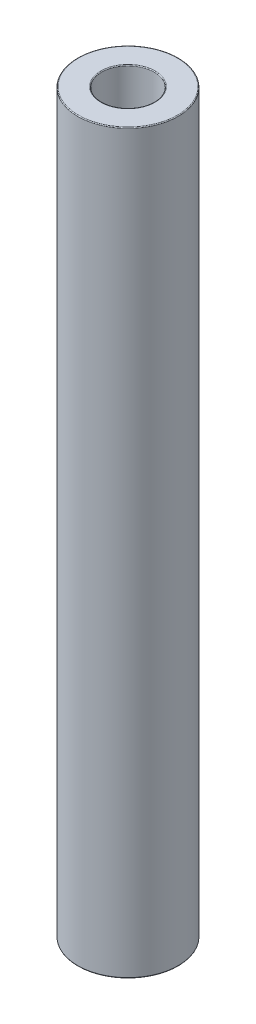
ISO-10303-21;
HEADER;
FILE_DESCRIPTION(('STEP AP214'),'2;1');
FILE_NAME('part.step','',(''),(''),'','','');
FILE_SCHEMA(('AUTOMOTIVE_DESIGN { 1 0 10303 214 1 1 1 1 }'));
ENDSEC;
DATA;
#1=APPLICATION_CONTEXT('core data for automotive mechanical design processes');
#2=APPLICATION_PROTOCOL_DEFINITION('international standard','automotive_design',2000,#1);
#3=PRODUCT_CONTEXT('',#1,'mechanical');
#4=PRODUCT('Part','Part','',(#3));
#5=PRODUCT_RELATED_PRODUCT_CATEGORY('part','',(#4));
#6=PRODUCT_DEFINITION_FORMATION('','',#4);
#7=PRODUCT_DEFINITION_CONTEXT('part definition',#1,'design');
#8=PRODUCT_DEFINITION('design','',#6,#7);
#9=PRODUCT_DEFINITION_SHAPE('','',#8);
#10=(LENGTH_UNIT() NAMED_UNIT(*) SI_UNIT(.MILLI.,.METRE.));
#11=(NAMED_UNIT(*) PLANE_ANGLE_UNIT() SI_UNIT($,.RADIAN.));
#12=(NAMED_UNIT(*) SI_UNIT($,.STERADIAN.) SOLID_ANGLE_UNIT());
#13=UNCERTAINTY_MEASURE_WITH_UNIT(LENGTH_MEASURE(1.E-05),#10,'distance_accuracy_value','');
#14=(GEOMETRIC_REPRESENTATION_CONTEXT(3) GLOBAL_UNCERTAINTY_ASSIGNED_CONTEXT((#13)) GLOBAL_UNIT_ASSIGNED_CONTEXT((#10,
#11,#12)) REPRESENTATION_CONTEXT('',''));
#15=CARTESIAN_POINT('',(0.,0.,0.));
#16=DIRECTION('',(0.,0.,1.));
#17=DIRECTION('',(1.,0.,0.));
#18=AXIS2_PLACEMENT_3D('',#15,#16,#17);
#19=CARTESIAN_POINT('',(0.,34.925,0.));
#20=DIRECTION('',(0.,1.,0.));
#21=DIRECTION('',(0.,0.,1.));
#22=AXIS2_PLACEMENT_3D('',#19,#20,#21);
#23=PLANE('',#22);
#24=CARTESIAN_POINT('',(0.,34.925,0.));
#25=DIRECTION('',(0.,1.,0.));
#26=DIRECTION('',(0.,0.,1.));
#27=AXIS2_PLACEMENT_3D('',#24,#25,#26);
#28=CIRCLE('',#27,2.576199953);
#29=CARTESIAN_POINT('',(0.,34.925,2.576199953));
#30=VERTEX_POINT('',#29);
#31=EDGE_CURVE('E10',#30,#30,#28,.F.);
#32=ORIENTED_EDGE('',*,*,#31,.T.);
#33=EDGE_LOOP('',(#32));
#34=FACE_BOUND('',#33,.T.);
#35=CARTESIAN_POINT('',(0.,34.925,0.));
#36=DIRECTION('',(0.,1.,0.));
#37=DIRECTION('',(0.,0.,1.));
#38=AXIS2_PLACEMENT_3D('',#35,#36,#37);
#39=CIRCLE('',#38,4.6863);
#40=CARTESIAN_POINT('',(0.,34.925,4.6863));
#41=VERTEX_POINT('',#40);
#42=EDGE_CURVE('E22',#41,#41,#39,.T.);
#43=ORIENTED_EDGE('',*,*,#42,.T.);
#44=EDGE_LOOP('',(#43));
#45=FACE_BOUND('',#44,.T.);
#46=ADVANCED_FACE('F15',(#34,#45),#23,.T.);
#47=CARTESIAN_POINT('',(0.,-34.925,0.));
#48=DIRECTION('',(0.,1.,0.));
#49=DIRECTION('',(0.,0.,1.));
#50=AXIS2_PLACEMENT_3D('',#47,#48,#49);
#51=PLANE('',#50);
#52=CARTESIAN_POINT('',(0.,-34.925,0.));
#53=DIRECTION('',(0.,1.,0.));
#54=DIRECTION('',(0.,0.,1.));
#55=AXIS2_PLACEMENT_3D('',#52,#53,#54);
#56=CIRCLE('',#55,2.576199953);
#57=CARTESIAN_POINT('',(0.,-34.925,2.576199953));
#58=VERTEX_POINT('',#57);
#59=EDGE_CURVE('E41',#58,#58,#56,.T.);
#60=ORIENTED_EDGE('',*,*,#59,.T.);
#61=EDGE_LOOP('',(#60));
#62=FACE_BOUND('',#61,.T.);
#63=CARTESIAN_POINT('',(0.,-34.925,0.));
#64=DIRECTION('',(0.,1.,0.));
#65=DIRECTION('',(0.,0.,1.));
#66=AXIS2_PLACEMENT_3D('',#63,#64,#65);
#67=CIRCLE('',#66,4.6863);
#68=CARTESIAN_POINT('',(0.,-34.925,4.6863));
#69=VERTEX_POINT('',#68);
#70=EDGE_CURVE('E44',#69,#69,#67,.F.);
#71=ORIENTED_EDGE('',*,*,#70,.T.);
#72=EDGE_LOOP('',(#71));
#73=FACE_BOUND('',#72,.T.);
#74=ADVANCED_FACE('F48',(#62,#73),#51,.F.);
#75=CARTESIAN_POINT('',(0.,34.925,0.));
#76=DIRECTION('',(0.,-1.,0.));
#77=DIRECTION('',(0.,0.,-1.));
#78=AXIS2_PLACEMENT_3D('',#75,#76,#77);
#79=CYLINDRICAL_SURFACE('',#78,4.7625);
#80=CARTESIAN_POINT('',(0.,-34.8488,0.));
#81=DIRECTION('',(0.,1.,0.));
#82=DIRECTION('',(0.,0.,1.));
#83=AXIS2_PLACEMENT_3D('',#80,#81,#82);
#84=CIRCLE('',#83,4.7625);
#85=CARTESIAN_POINT('',(0.,-34.8488,4.7625));
#86=VERTEX_POINT('',#85);
#87=EDGE_CURVE('E26',#86,#86,#84,.T.);
#88=ORIENTED_EDGE('',*,*,#87,.T.);
#89=EDGE_LOOP('',(#88));
#90=FACE_BOUND('',#89,.T.);
#91=CARTESIAN_POINT('',(0.,34.8488,0.));
#92=DIRECTION('',(0.,1.,0.));
#93=DIRECTION('',(0.,0.,1.));
#94=AXIS2_PLACEMENT_3D('',#91,#92,#93);
#95=CIRCLE('',#94,4.7625);
#96=CARTESIAN_POINT('',(0.,34.8488,4.7625));
#97=VERTEX_POINT('',#96);
#98=EDGE_CURVE('E30',#97,#97,#95,.F.);
#99=ORIENTED_EDGE('',*,*,#98,.T.);
#100=EDGE_LOOP('',(#99));
#101=FACE_BOUND('',#100,.T.);
#102=ADVANCED_FACE('F58',(#90,#101),#79,.T.);
#103=CARTESIAN_POINT('',(0.,34.925,0.));
#104=DIRECTION('',(0.,-1.,0.));
#105=DIRECTION('',(0.,0.,-1.));
#106=AXIS2_PLACEMENT_3D('',#103,#104,#105);
#107=CYLINDRICAL_SURFACE('',#106,2.499999953);
#108=CARTESIAN_POINT('',(0.,-34.8488,0.));
#109=DIRECTION('',(0.,1.,0.));
#110=DIRECTION('',(0.,0.,1.));
#111=AXIS2_PLACEMENT_3D('',#108,#109,#110);
#112=CIRCLE('',#111,2.499999953);
#113=CARTESIAN_POINT('',(0.,-34.8488,2.499999953));
#114=VERTEX_POINT('',#113);
#115=EDGE_CURVE('E35',#114,#114,#112,.F.);
#116=ORIENTED_EDGE('',*,*,#115,.T.);
#117=EDGE_LOOP('',(#116));
#118=FACE_BOUND('',#117,.T.);
#119=CARTESIAN_POINT('',(0.,34.8488,0.));
#120=DIRECTION('',(0.,1.,0.));
#121=DIRECTION('',(0.,0.,1.));
#122=AXIS2_PLACEMENT_3D('',#119,#120,#121);
#123=CIRCLE('',#122,2.499999953);
#124=CARTESIAN_POINT('',(0.,34.8488,2.499999953));
#125=VERTEX_POINT('',#124);
#126=EDGE_CURVE('E38',#125,#125,#123,.T.);
#127=ORIENTED_EDGE('',*,*,#126,.T.);
#128=EDGE_LOOP('',(#127));
#129=FACE_BOUND('',#128,.T.);
#130=ADVANCED_FACE('F61',(#118,#129),#107,.F.);
#131=CARTESIAN_POINT('',(0.,-34.8488,0.));
#132=DIRECTION('',(0.,1.,0.));
#133=DIRECTION('',(0.,0.,1.));
#134=AXIS2_PLACEMENT_3D('',#131,#132,#133);
#135=TOROIDAL_SURFACE('',#134,2.576199953,0.0762);
#136=ORIENTED_EDGE('',*,*,#115,.F.);
#137=EDGE_LOOP('',(#136));
#138=FACE_BOUND('',#137,.T.);
#139=ORIENTED_EDGE('',*,*,#59,.F.);
#140=EDGE_LOOP('',(#139));
#141=FACE_BOUND('',#140,.T.);
#142=ADVANCED_FACE('F54',(#138,#141),#135,.T.);
#143=CARTESIAN_POINT('',(0.,-34.8488,0.));
#144=DIRECTION('',(0.,1.,0.));
#145=DIRECTION('',(0.,0.,1.));
#146=AXIS2_PLACEMENT_3D('',#143,#144,#145);
#147=TOROIDAL_SURFACE('',#146,4.6863,0.0762);
#148=ORIENTED_EDGE('',*,*,#70,.F.);
#149=EDGE_LOOP('',(#148));
#150=FACE_BOUND('',#149,.T.);
#151=ORIENTED_EDGE('',*,*,#87,.F.);
#152=EDGE_LOOP('',(#151));
#153=FACE_BOUND('',#152,.T.);
#154=ADVANCED_FACE('F50',(#150,#153),#147,.T.);
#155=CARTESIAN_POINT('',(0.,34.8488,0.));
#156=DIRECTION('',(0.,1.,0.));
#157=DIRECTION('',(0.,0.,1.));
#158=AXIS2_PLACEMENT_3D('',#155,#156,#157);
#159=TOROIDAL_SURFACE('',#158,2.576199953,0.0762);
#160=ORIENTED_EDGE('',*,*,#31,.F.);
#161=EDGE_LOOP('',(#160));
#162=FACE_BOUND('',#161,.T.);
#163=ORIENTED_EDGE('',*,*,#126,.F.);
#164=EDGE_LOOP('',(#163));
#165=FACE_BOUND('',#164,.T.);
#166=ADVANCED_FACE('F53',(#162,#165),#159,.T.);
#167=CARTESIAN_POINT('',(0.,34.8488,0.));
#168=DIRECTION('',(0.,1.,0.));
#169=DIRECTION('',(0.,0.,1.));
#170=AXIS2_PLACEMENT_3D('',#167,#168,#169);
#171=TOROIDAL_SURFACE('',#170,4.6863,0.0762);
#172=ORIENTED_EDGE('',*,*,#98,.F.);
#173=EDGE_LOOP('',(#172));
#174=FACE_BOUND('',#173,.T.);
#175=ORIENTED_EDGE('',*,*,#42,.F.);
#176=EDGE_LOOP('',(#175));
#177=FACE_BOUND('',#176,.T.);
#178=ADVANCED_FACE('F17',(#174,#177),#171,.T.);
#179=CLOSED_SHELL('',(#46,#74,#102,#130,#142,#154,#166,#178));
#180=MANIFOLD_SOLID_BREP('B1',#179);
#181=ADVANCED_BREP_SHAPE_REPRESENTATION('',(#18,#180),#14);
#182=SHAPE_DEFINITION_REPRESENTATION(#9,#181);
ENDSEC;
END-ISO-10303-21;
